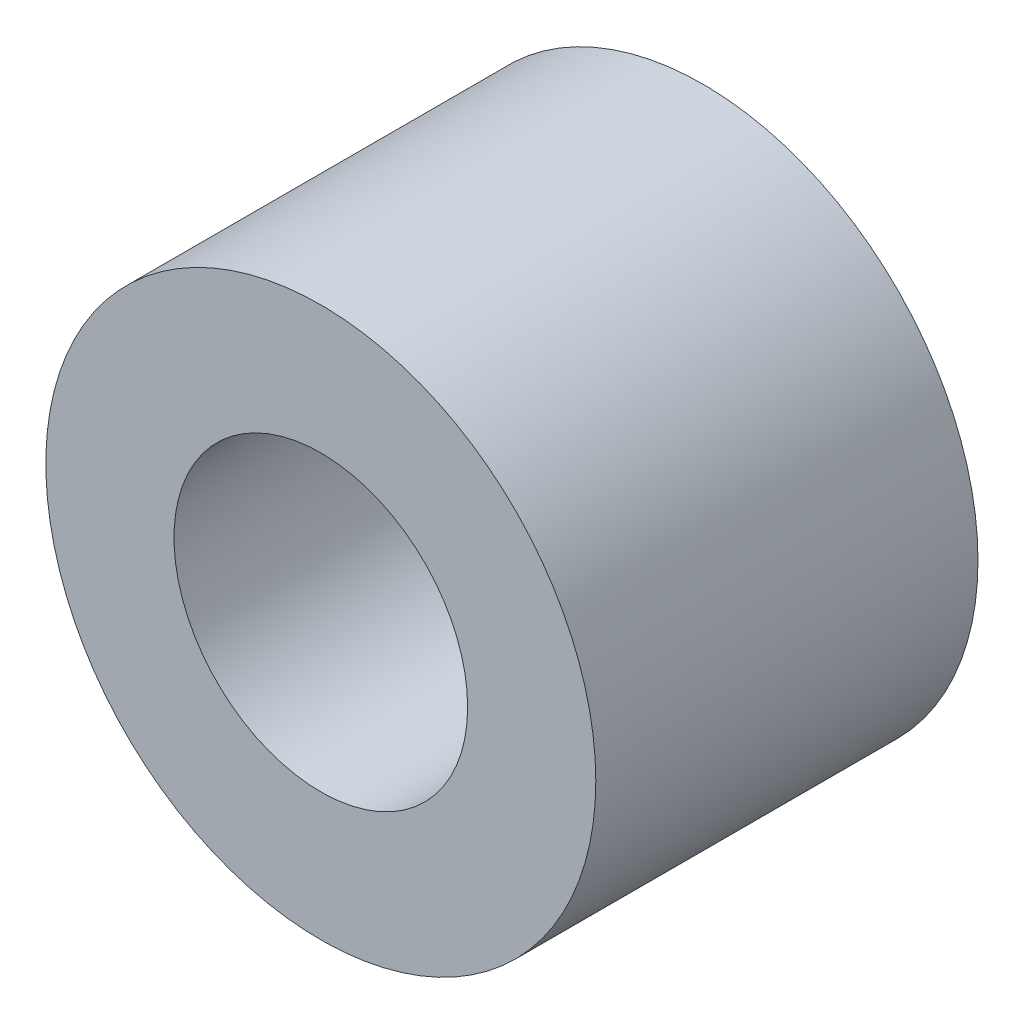
ISO-10303-21;
HEADER;
FILE_DESCRIPTION(('STEP AP214'),'2;1');
FILE_NAME('part.step','',(''),(''),'','','');
FILE_SCHEMA(('AUTOMOTIVE_DESIGN { 1 0 10303 214 1 1 1 1 }'));
ENDSEC;
DATA;
#1=APPLICATION_CONTEXT('core data for automotive mechanical design processes');
#2=APPLICATION_PROTOCOL_DEFINITION('international standard','automotive_design',2000,#1);
#3=PRODUCT_CONTEXT('',#1,'mechanical');
#4=PRODUCT('Part','Part','',(#3));
#5=PRODUCT_RELATED_PRODUCT_CATEGORY('part','',(#4));
#6=PRODUCT_DEFINITION_FORMATION('','',#4);
#7=PRODUCT_DEFINITION_CONTEXT('part definition',#1,'design');
#8=PRODUCT_DEFINITION('design','',#6,#7);
#9=PRODUCT_DEFINITION_SHAPE('','',#8);
#10=(LENGTH_UNIT() NAMED_UNIT(*) SI_UNIT(.MILLI.,.METRE.));
#11=(NAMED_UNIT(*) PLANE_ANGLE_UNIT() SI_UNIT($,.RADIAN.));
#12=(NAMED_UNIT(*) SI_UNIT($,.STERADIAN.) SOLID_ANGLE_UNIT());
#13=UNCERTAINTY_MEASURE_WITH_UNIT(LENGTH_MEASURE(1.E-05),#10,'distance_accuracy_value','');
#14=(GEOMETRIC_REPRESENTATION_CONTEXT(3) GLOBAL_UNCERTAINTY_ASSIGNED_CONTEXT((#13)) GLOBAL_UNIT_ASSIGNED_CONTEXT((#10,
#11,#12)) REPRESENTATION_CONTEXT('',''));
#15=CARTESIAN_POINT('',(0.,0.,0.));
#16=DIRECTION('',(0.,0.,1.));
#17=DIRECTION('',(1.,0.,0.));
#18=AXIS2_PLACEMENT_3D('',#15,#16,#17);
#19=CARTESIAN_POINT('',(0.,0.,4.1));
#20=DIRECTION('',(0.,0.,1.));
#21=DIRECTION('',(1.,0.,0.));
#22=AXIS2_PLACEMENT_3D('',#19,#20,#21);
#23=PLANE('',#22);
#24=CARTESIAN_POINT('',(0.,0.,4.1));
#25=DIRECTION('',(0.,0.,1.));
#26=DIRECTION('',(1.,0.,0.));
#27=AXIS2_PLACEMENT_3D('',#24,#25,#26);
#28=CIRCLE('',#27,2.95);
#29=CARTESIAN_POINT('',(2.95,0.,4.1));
#30=VERTEX_POINT('',#29);
#31=EDGE_CURVE('E10',#30,#30,#28,.T.);
#32=ORIENTED_EDGE('',*,*,#31,.T.);
#33=EDGE_LOOP('',(#32));
#34=FACE_BOUND('',#33,.T.);
#35=CARTESIAN_POINT('',(0.,0.,4.1));
#36=DIRECTION('',(0.,0.,1.));
#37=DIRECTION('',(1.,0.,0.));
#38=AXIS2_PLACEMENT_3D('',#35,#36,#37);
#39=CIRCLE('',#38,1.575);
#40=CARTESIAN_POINT('',(1.575,0.,4.1));
#41=VERTEX_POINT('',#40);
#42=EDGE_CURVE('E41',#41,#41,#39,.T.);
#43=ORIENTED_EDGE('',*,*,#42,.F.);
#44=EDGE_LOOP('',(#43));
#45=FACE_BOUND('',#44,.T.);
#46=ADVANCED_FACE('F30',(#34,#45),#23,.T.);
#47=CARTESIAN_POINT('',(0.,0.,0.));
#48=DIRECTION('',(0.,0.,1.));
#49=DIRECTION('',(1.,0.,0.));
#50=AXIS2_PLACEMENT_3D('',#47,#48,#49);
#51=PLANE('',#50);
#52=CARTESIAN_POINT('',(0.,0.,0.));
#53=DIRECTION('',(0.,0.,1.));
#54=DIRECTION('',(1.,0.,0.));
#55=AXIS2_PLACEMENT_3D('',#52,#53,#54);
#56=CIRCLE('',#55,2.95);
#57=CARTESIAN_POINT('',(2.95,0.,0.));
#58=VERTEX_POINT('',#57);
#59=EDGE_CURVE('E34',#58,#58,#56,.T.);
#60=ORIENTED_EDGE('',*,*,#59,.F.);
#61=EDGE_LOOP('',(#60));
#62=FACE_BOUND('',#61,.T.);
#63=CARTESIAN_POINT('',(0.,0.,0.));
#64=DIRECTION('',(0.,0.,1.));
#65=DIRECTION('',(1.,0.,0.));
#66=AXIS2_PLACEMENT_3D('',#63,#64,#65);
#67=CIRCLE('',#66,1.575);
#68=CARTESIAN_POINT('',(1.575,0.,0.));
#69=VERTEX_POINT('',#68);
#70=EDGE_CURVE('E43',#69,#69,#67,.T.);
#71=ORIENTED_EDGE('',*,*,#70,.T.);
#72=EDGE_LOOP('',(#71));
#73=FACE_BOUND('',#72,.T.);
#74=ADVANCED_FACE('F53',(#62,#73),#51,.F.);
#75=CARTESIAN_POINT('',(0.,0.,4.1));
#76=DIRECTION('',(0.,0.,-1.));
#77=DIRECTION('',(-1.,0.,0.));
#78=AXIS2_PLACEMENT_3D('',#75,#76,#77);
#79=CYLINDRICAL_SURFACE('',#78,2.95);
#80=ORIENTED_EDGE('',*,*,#31,.F.);
#81=EDGE_LOOP('',(#80));
#82=FACE_BOUND('',#81,.T.);
#83=ORIENTED_EDGE('',*,*,#59,.T.);
#84=EDGE_LOOP('',(#83));
#85=FACE_BOUND('',#84,.T.);
#86=ADVANCED_FACE('F32',(#82,#85),#79,.T.);
#87=CARTESIAN_POINT('',(0.,0.,4.1));
#88=DIRECTION('',(0.,0.,-1.));
#89=DIRECTION('',(-1.,0.,0.));
#90=AXIS2_PLACEMENT_3D('',#87,#88,#89);
#91=CYLINDRICAL_SURFACE('',#90,1.575);
#92=ORIENTED_EDGE('',*,*,#42,.T.);
#93=EDGE_LOOP('',(#92));
#94=FACE_BOUND('',#93,.T.);
#95=ORIENTED_EDGE('',*,*,#70,.F.);
#96=EDGE_LOOP('',(#95));
#97=FACE_BOUND('',#96,.T.);
#98=ADVANCED_FACE('F49',(#94,#97),#91,.F.);
#99=CLOSED_SHELL('',(#46,#74,#86,#98));
#100=MANIFOLD_SOLID_BREP('B2',#99);
#101=ADVANCED_BREP_SHAPE_REPRESENTATION('',(#18,#100),#14);
#102=SHAPE_DEFINITION_REPRESENTATION(#9,#101);
ENDSEC;
END-ISO-10303-21;
